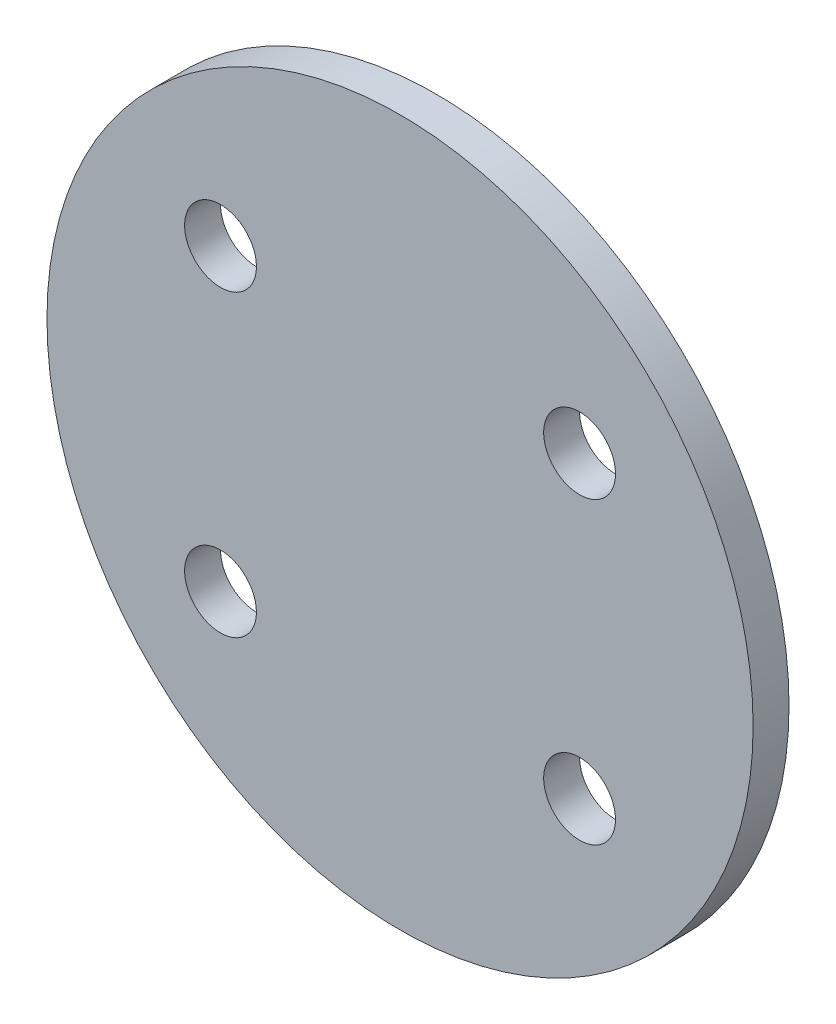
ISO-10303-21;
HEADER;
FILE_DESCRIPTION(('STEP AP214'),'2;1');
FILE_NAME('part.step','',(''),(''),'','','');
FILE_SCHEMA(('AUTOMOTIVE_DESIGN { 1 0 10303 214 1 1 1 1 }'));
ENDSEC;
DATA;
#1=APPLICATION_CONTEXT('core data for automotive mechanical design processes');
#2=APPLICATION_PROTOCOL_DEFINITION('international standard','automotive_design',2000,#1);
#3=PRODUCT_CONTEXT('',#1,'mechanical');
#4=PRODUCT('Part','Part','',(#3));
#5=PRODUCT_RELATED_PRODUCT_CATEGORY('part','',(#4));
#6=PRODUCT_DEFINITION_FORMATION('','',#4);
#7=PRODUCT_DEFINITION_CONTEXT('part definition',#1,'design');
#8=PRODUCT_DEFINITION('design','',#6,#7);
#9=PRODUCT_DEFINITION_SHAPE('','',#8);
#10=(LENGTH_UNIT() NAMED_UNIT(*) SI_UNIT(.MILLI.,.METRE.));
#11=(NAMED_UNIT(*) PLANE_ANGLE_UNIT() SI_UNIT($,.RADIAN.));
#12=(NAMED_UNIT(*) SI_UNIT($,.STERADIAN.) SOLID_ANGLE_UNIT());
#13=UNCERTAINTY_MEASURE_WITH_UNIT(LENGTH_MEASURE(1.E-05),#10,'distance_accuracy_value','');
#14=(GEOMETRIC_REPRESENTATION_CONTEXT(3) GLOBAL_UNCERTAINTY_ASSIGNED_CONTEXT((#13)) GLOBAL_UNIT_ASSIGNED_CONTEXT((#10,
#11,#12)) REPRESENTATION_CONTEXT('',''));
#15=CARTESIAN_POINT('',(0.,0.,0.));
#16=DIRECTION('',(0.,0.,1.));
#17=DIRECTION('',(1.,0.,0.));
#18=AXIS2_PLACEMENT_3D('',#15,#16,#17);
#19=CARTESIAN_POINT('',(0.,0.,3.));
#20=DIRECTION('',(0.,0.,1.));
#21=DIRECTION('',(1.,0.,0.));
#22=AXIS2_PLACEMENT_3D('',#19,#20,#21);
#23=PLANE('',#22);
#24=CARTESIAN_POINT('',(15.,12.5,3.));
#25=DIRECTION('',(0.,0.,1.));
#26=DIRECTION('',(1.,0.,0.));
#27=AXIS2_PLACEMENT_3D('',#24,#25,#26);
#28=CIRCLE('',#27,3.);
#29=CARTESIAN_POINT('',(18.,12.5,3.));
#30=VERTEX_POINT('',#29);
#31=EDGE_CURVE('E52',#30,#30,#28,.T.);
#32=ORIENTED_EDGE('',*,*,#31,.F.);
#33=EDGE_LOOP('',(#32));
#34=FACE_BOUND('',#33,.T.);
#35=CARTESIAN_POINT('',(-15.,-12.5,3.));
#36=DIRECTION('',(0.,0.,1.));
#37=DIRECTION('',(1.,0.,0.));
#38=AXIS2_PLACEMENT_3D('',#35,#36,#37);
#39=CIRCLE('',#38,3.);
#40=CARTESIAN_POINT('',(-12.,-12.5,3.));
#41=VERTEX_POINT('',#40);
#42=EDGE_CURVE('E41',#41,#41,#39,.T.);
#43=ORIENTED_EDGE('',*,*,#42,.F.);
#44=EDGE_LOOP('',(#43));
#45=FACE_BOUND('',#44,.T.);
#46=CARTESIAN_POINT('',(0.,0.,3.));
#47=DIRECTION('',(0.,0.,1.));
#48=DIRECTION('',(1.,0.,0.));
#49=AXIS2_PLACEMENT_3D('',#46,#47,#48);
#50=CIRCLE('',#49,29.5);
#51=CARTESIAN_POINT('',(29.5,0.,3.));
#52=VERTEX_POINT('',#51);
#53=EDGE_CURVE('E10',#52,#52,#50,.T.);
#54=ORIENTED_EDGE('',*,*,#53,.T.);
#55=EDGE_LOOP('',(#54));
#56=FACE_BOUND('',#55,.T.);
#57=CARTESIAN_POINT('',(15.,-12.5,3.));
#58=DIRECTION('',(0.,0.,1.));
#59=DIRECTION('',(1.,0.,0.));
#60=AXIS2_PLACEMENT_3D('',#57,#58,#59);
#61=CIRCLE('',#60,3.);
#62=CARTESIAN_POINT('',(18.,-12.5,3.));
#63=VERTEX_POINT('',#62);
#64=EDGE_CURVE('E46',#63,#63,#61,.T.);
#65=ORIENTED_EDGE('',*,*,#64,.F.);
#66=EDGE_LOOP('',(#65));
#67=FACE_BOUND('',#66,.T.);
#68=CARTESIAN_POINT('',(-15.,12.5,3.));
#69=DIRECTION('',(0.,0.,1.));
#70=DIRECTION('',(1.,0.,0.));
#71=AXIS2_PLACEMENT_3D('',#68,#69,#70);
#72=CIRCLE('',#71,3.);
#73=CARTESIAN_POINT('',(-12.,12.5,3.));
#74=VERTEX_POINT('',#73);
#75=EDGE_CURVE('E58',#74,#74,#72,.T.);
#76=ORIENTED_EDGE('',*,*,#75,.F.);
#77=EDGE_LOOP('',(#76));
#78=FACE_BOUND('',#77,.T.);
#79=ADVANCED_FACE('F30',(#34,#45,#56,#67,#78),#23,.T.);
#80=CARTESIAN_POINT('',(0.,0.,0.));
#81=DIRECTION('',(0.,0.,1.));
#82=DIRECTION('',(1.,0.,0.));
#83=AXIS2_PLACEMENT_3D('',#80,#81,#82);
#84=PLANE('',#83);
#85=CARTESIAN_POINT('',(15.,12.5,0.));
#86=DIRECTION('',(0.,0.,1.));
#87=DIRECTION('',(1.,0.,0.));
#88=AXIS2_PLACEMENT_3D('',#85,#86,#87);
#89=CIRCLE('',#88,3.);
#90=CARTESIAN_POINT('',(18.,12.5,0.));
#91=VERTEX_POINT('',#90);
#92=EDGE_CURVE('E55',#91,#91,#89,.T.);
#93=ORIENTED_EDGE('',*,*,#92,.T.);
#94=EDGE_LOOP('',(#93));
#95=FACE_BOUND('',#94,.T.);
#96=CARTESIAN_POINT('',(-15.,-12.5,0.));
#97=DIRECTION('',(0.,0.,1.));
#98=DIRECTION('',(1.,0.,0.));
#99=AXIS2_PLACEMENT_3D('',#96,#97,#98);
#100=CIRCLE('',#99,3.);
#101=CARTESIAN_POINT('',(-12.,-12.5,0.));
#102=VERTEX_POINT('',#101);
#103=EDGE_CURVE('E43',#102,#102,#100,.T.);
#104=ORIENTED_EDGE('',*,*,#103,.T.);
#105=EDGE_LOOP('',(#104));
#106=FACE_BOUND('',#105,.T.);
#107=CARTESIAN_POINT('',(0.,0.,0.));
#108=DIRECTION('',(0.,0.,1.));
#109=DIRECTION('',(1.,0.,0.));
#110=AXIS2_PLACEMENT_3D('',#107,#108,#109);
#111=CIRCLE('',#110,29.5);
#112=CARTESIAN_POINT('',(29.5,0.,0.));
#113=VERTEX_POINT('',#112);
#114=EDGE_CURVE('E34',#113,#113,#111,.T.);
#115=ORIENTED_EDGE('',*,*,#114,.F.);
#116=EDGE_LOOP('',(#115));
#117=FACE_BOUND('',#116,.T.);
#118=CARTESIAN_POINT('',(15.,-12.5,0.));
#119=DIRECTION('',(0.,0.,1.));
#120=DIRECTION('',(1.,0.,0.));
#121=AXIS2_PLACEMENT_3D('',#118,#119,#120);
#122=CIRCLE('',#121,3.);
#123=CARTESIAN_POINT('',(18.,-12.5,0.));
#124=VERTEX_POINT('',#123);
#125=EDGE_CURVE('E49',#124,#124,#122,.T.);
#126=ORIENTED_EDGE('',*,*,#125,.T.);
#127=EDGE_LOOP('',(#126));
#128=FACE_BOUND('',#127,.T.);
#129=CARTESIAN_POINT('',(-15.,12.5,0.));
#130=DIRECTION('',(0.,0.,1.));
#131=DIRECTION('',(1.,0.,0.));
#132=AXIS2_PLACEMENT_3D('',#129,#130,#131);
#133=CIRCLE('',#132,3.);
#134=CARTESIAN_POINT('',(-12.,12.5,0.));
#135=VERTEX_POINT('',#134);
#136=EDGE_CURVE('E61',#135,#135,#133,.T.);
#137=ORIENTED_EDGE('',*,*,#136,.T.);
#138=EDGE_LOOP('',(#137));
#139=FACE_BOUND('',#138,.T.);
#140=ADVANCED_FACE('F71',(#95,#106,#117,#128,#139),#84,.F.);
#141=CARTESIAN_POINT('',(0.,0.,3.));
#142=DIRECTION('',(0.,0.,-1.));
#143=DIRECTION('',(-1.,0.,0.));
#144=AXIS2_PLACEMENT_3D('',#141,#142,#143);
#145=CYLINDRICAL_SURFACE('',#144,29.5);
#146=ORIENTED_EDGE('',*,*,#53,.F.);
#147=EDGE_LOOP('',(#146));
#148=FACE_BOUND('',#147,.T.);
#149=ORIENTED_EDGE('',*,*,#114,.T.);
#150=EDGE_LOOP('',(#149));
#151=FACE_BOUND('',#150,.T.);
#152=ADVANCED_FACE('F32',(#148,#151),#145,.T.);
#153=CARTESIAN_POINT('',(-15.,-12.5,3.));
#154=DIRECTION('',(0.,0.,-1.));
#155=DIRECTION('',(-1.,0.,0.));
#156=AXIS2_PLACEMENT_3D('',#153,#154,#155);
#157=CYLINDRICAL_SURFACE('',#156,3.);
#158=ORIENTED_EDGE('',*,*,#42,.T.);
#159=EDGE_LOOP('',(#158));
#160=FACE_BOUND('',#159,.T.);
#161=ORIENTED_EDGE('',*,*,#103,.F.);
#162=EDGE_LOOP('',(#161));
#163=FACE_BOUND('',#162,.T.);
#164=ADVANCED_FACE('F81',(#160,#163),#157,.F.);
#165=CARTESIAN_POINT('',(15.,-12.5,3.));
#166=DIRECTION('',(0.,0.,-1.));
#167=DIRECTION('',(-1.,0.,0.));
#168=AXIS2_PLACEMENT_3D('',#165,#166,#167);
#169=CYLINDRICAL_SURFACE('',#168,3.);
#170=ORIENTED_EDGE('',*,*,#64,.T.);
#171=EDGE_LOOP('',(#170));
#172=FACE_BOUND('',#171,.T.);
#173=ORIENTED_EDGE('',*,*,#125,.F.);
#174=EDGE_LOOP('',(#173));
#175=FACE_BOUND('',#174,.T.);
#176=ADVANCED_FACE('F84',(#172,#175),#169,.F.);
#177=CARTESIAN_POINT('',(15.,12.5,3.));
#178=DIRECTION('',(0.,0.,-1.));
#179=DIRECTION('',(-1.,0.,0.));
#180=AXIS2_PLACEMENT_3D('',#177,#178,#179);
#181=CYLINDRICAL_SURFACE('',#180,3.);
#182=ORIENTED_EDGE('',*,*,#31,.T.);
#183=EDGE_LOOP('',(#182));
#184=FACE_BOUND('',#183,.T.);
#185=ORIENTED_EDGE('',*,*,#92,.F.);
#186=EDGE_LOOP('',(#185));
#187=FACE_BOUND('',#186,.T.);
#188=ADVANCED_FACE('F88',(#184,#187),#181,.F.);
#189=CARTESIAN_POINT('',(-15.,12.5,3.));
#190=DIRECTION('',(0.,0.,-1.));
#191=DIRECTION('',(-1.,0.,0.));
#192=AXIS2_PLACEMENT_3D('',#189,#190,#191);
#193=CYLINDRICAL_SURFACE('',#192,3.);
#194=ORIENTED_EDGE('',*,*,#75,.T.);
#195=EDGE_LOOP('',(#194));
#196=FACE_BOUND('',#195,.T.);
#197=ORIENTED_EDGE('',*,*,#136,.F.);
#198=EDGE_LOOP('',(#197));
#199=FACE_BOUND('',#198,.T.);
#200=ADVANCED_FACE('F67',(#196,#199),#193,.F.);
#201=CLOSED_SHELL('',(#79,#140,#152,#164,#176,#188,#200));
#202=MANIFOLD_SOLID_BREP('B2',#201);
#203=ADVANCED_BREP_SHAPE_REPRESENTATION('',(#18,#202),#14);
#204=SHAPE_DEFINITION_REPRESENTATION(#9,#203);
ENDSEC;
END-ISO-10303-21;
